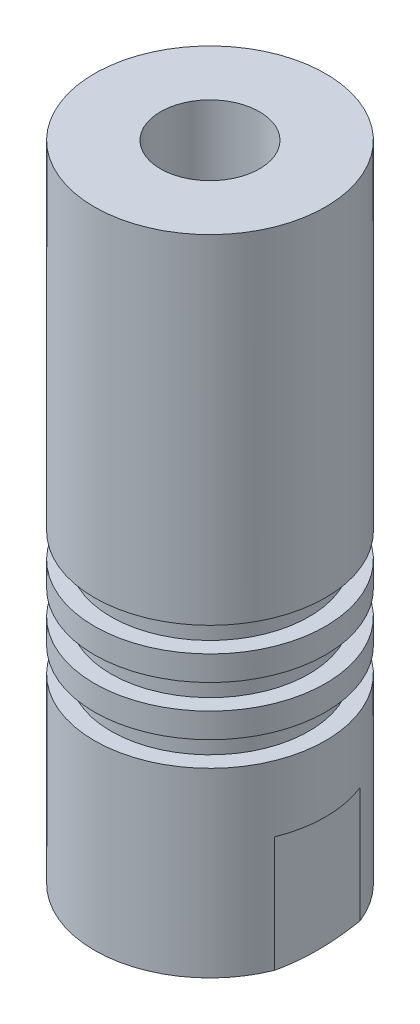
ISO-10303-21;
HEADER;
FILE_DESCRIPTION(('STEP AP214'),'2;1');
FILE_NAME('part.step','',(''),(''),'','','');
FILE_SCHEMA(('AUTOMOTIVE_DESIGN { 1 0 10303 214 1 1 1 1 }'));
ENDSEC;
DATA;
#1=APPLICATION_CONTEXT('core data for automotive mechanical design processes');
#2=APPLICATION_PROTOCOL_DEFINITION('international standard','automotive_design',2000,#1);
#3=PRODUCT_CONTEXT('',#1,'mechanical');
#4=PRODUCT('Part','Part','',(#3));
#5=PRODUCT_RELATED_PRODUCT_CATEGORY('part','',(#4));
#6=PRODUCT_DEFINITION_FORMATION('','',#4);
#7=PRODUCT_DEFINITION_CONTEXT('part definition',#1,'design');
#8=PRODUCT_DEFINITION('design','',#6,#7);
#9=PRODUCT_DEFINITION_SHAPE('','',#8);
#10=(LENGTH_UNIT() NAMED_UNIT(*) SI_UNIT(.MILLI.,.METRE.));
#11=(NAMED_UNIT(*) PLANE_ANGLE_UNIT() SI_UNIT($,.RADIAN.));
#12=(NAMED_UNIT(*) SI_UNIT($,.STERADIAN.) SOLID_ANGLE_UNIT());
#13=UNCERTAINTY_MEASURE_WITH_UNIT(LENGTH_MEASURE(1.E-05),#10,'distance_accuracy_value','');
#14=(GEOMETRIC_REPRESENTATION_CONTEXT(3) GLOBAL_UNCERTAINTY_ASSIGNED_CONTEXT((#13)) GLOBAL_UNIT_ASSIGNED_CONTEXT((#10,
#11,#12)) REPRESENTATION_CONTEXT('',''));
#15=CARTESIAN_POINT('',(0.,0.,0.));
#16=DIRECTION('',(0.,0.,1.));
#17=DIRECTION('',(1.,0.,0.));
#18=AXIS2_PLACEMENT_3D('',#15,#16,#17);
#19=CARTESIAN_POINT('',(0.,1.5,0.));
#20=DIRECTION('',(0.,1.,0.));
#21=DIRECTION('',(0.,0.,1.));
#22=AXIS2_PLACEMENT_3D('',#19,#20,#21);
#23=CONICAL_SURFACE('',#22,7.99999999999999,1.10714871779409);
#24=CARTESIAN_POINT('',(0.,0.,0.));
#25=DIRECTION('',(0.,1.,0.));
#26=DIRECTION('',(0.,0.,1.));
#27=AXIS2_PLACEMENT_3D('',#24,#25,#26);
#28=CIRCLE('',#27,4.99999999999998);
#29=CARTESIAN_POINT('',(0.,0.,4.99999999999998));
#30=VERTEX_POINT('',#29);
#31=EDGE_CURVE('E81',#30,#30,#28,.T.);
#32=ORIENTED_EDGE('',*,*,#31,.T.);
#33=EDGE_LOOP('',(#32));
#34=FACE_BOUND('',#33,.T.);
#35=CARTESIAN_POINT('',(-6.49999999999999,4.63960517836139,-12.7140020611741));
#36=CARTESIAN_POINT('',(-6.49999999999999,4.49493273691476,-12.3889791438294));
#37=CARTESIAN_POINT('',(-6.49999999999999,4.35117750702607,-12.0635434352985));
#38=CARTESIAN_POINT('',(-6.49999999999999,4.06600795170587,-11.4116234990025));
#39=CARTESIAN_POINT('',(-6.49999999999999,3.92459377917146,-11.0851392044028));
#40=CARTESIAN_POINT('',(-6.49999999999999,3.64433543055072,-10.4302489102803));
#41=CARTESIAN_POINT('',(-6.49999999999999,3.50549732908588,-10.1018403056813));
#42=CARTESIAN_POINT('',(-6.49999999999999,3.23142571950738,-9.44352872623451));
#43=CARTESIAN_POINT('',(-6.49999999999999,3.09619212071106,-9.11362578922608));
#44=CARTESIAN_POINT('',(-6.49999999999999,2.83048289305681,-8.45250376338199));
#45=CARTESIAN_POINT('',(-6.49999999999999,2.70000014874712,-8.12128754257229));
#46=CARTESIAN_POINT('',(-6.49999999999999,2.44483186701764,-7.45659634827721));
#47=CARTESIAN_POINT('',(-6.49999999999999,2.32014667007343,-7.12312124344746));
#48=CARTESIAN_POINT('',(-6.49999999999999,2.07840099908305,-6.45372644486896));
#49=CARTESIAN_POINT('',(-6.49999999999999,1.96133416663675,-6.11780905674865));
#50=CARTESIAN_POINT('',(-6.49999999999999,1.73702665581905,-5.44272397498847));
#51=CARTESIAN_POINT('',(-6.49999999999999,1.62978438251793,-5.10355681882979));
#52=CARTESIAN_POINT('',(-6.49999999999999,1.50145760944831,-4.66929022803816));
#53=CARTESIAN_POINT('',(-6.49999999999999,1.47439812441263,-4.57594563698323));
#54=CARTESIAN_POINT('',(-6.49999999999999,1.42132141191772,-4.38896083134469));
#55=CARTESIAN_POINT('',(-6.49999999999999,1.39530416853117,-4.29532062130229));
#56=CARTESIAN_POINT('',(-6.49999999999999,1.31884649816979,-4.01363447591895));
#57=CARTESIAN_POINT('',(-6.49999999999999,1.27009239909997,-3.82513345071698));
#58=CARTESIAN_POINT('',(-6.49999999999999,1.13144347216063,-3.25712110004858));
#59=CARTESIAN_POINT('',(-6.49999999999999,1.04932049996449,-2.87562365996438));
#60=CARTESIAN_POINT('',(-6.49999999999999,0.946261094020701,-2.29977813127616));
#61=CARTESIAN_POINT('',(-6.49999999999999,0.915259699355964,-2.10720712065049));
#62=CARTESIAN_POINT('',(-6.49999999999999,0.860714592579146,-1.7210183720728));
#63=CARTESIAN_POINT('',(-6.49999999999999,0.837170046736164,-1.52740075360301));
#64=CARTESIAN_POINT('',(-6.49999999999999,0.798232474629815,-1.13985753736791));
#65=CARTESIAN_POINT('',(-6.49999999999999,0.78281812154265,-0.945934097286736));
#66=CARTESIAN_POINT('',(-6.49999999999999,0.760510527948946,-0.557594838663115));
#67=CARTESIAN_POINT('',(-6.49999999999999,0.753617189046767,-0.363179025832271));
#68=CARTESIAN_POINT('',(-6.49999999999999,0.748572275423311,0.0257307608028582));
#69=CARTESIAN_POINT('',(-6.49999999999999,0.750419038007415,0.220224712703199));
#70=CARTESIAN_POINT('',(-6.49999999999999,0.76278940638265,0.608953775199544));
#71=CARTESIAN_POINT('',(-6.49999999999999,0.773314033718197,0.803188852624818));
#72=CARTESIAN_POINT('',(-6.49999999999999,0.806501889662758,1.24090602694894));
#73=CARTESIAN_POINT('',(-6.49999999999999,0.831590920516132,1.48420561931385));
#74=CARTESIAN_POINT('',(-6.49999999999999,0.893852125406738,1.96924724220696));
#75=CARTESIAN_POINT('',(-6.49999999999999,0.931025317420885,2.21098913976373));
#76=CARTESIAN_POINT('',(-6.49999999999999,1.01604103903786,2.69277716302994));
#77=CARTESIAN_POINT('',(-6.49999999999999,1.06389244038228,2.93282170644527));
#78=CARTESIAN_POINT('',(-6.49999999999999,1.16871694054054,3.41088019593747));
#79=CARTESIAN_POINT('',(-6.49999999999999,1.22568964445531,3.64889422945387));
#80=CARTESIAN_POINT('',(-6.49999999999999,1.34820588611418,4.1264246278799));
#81=CARTESIAN_POINT('',(-6.49999999999999,1.41386316573231,4.36591159529887));
#82=CARTESIAN_POINT('',(-6.49999999999999,1.55170831935892,4.84285142414976));
#83=CARTESIAN_POINT('',(-6.49999999999999,1.62389277522808,5.08030527977033));
#84=CARTESIAN_POINT('',(-6.49999999999999,1.77367698683179,5.55344813381403));
#85=CARTESIAN_POINT('',(-6.49999999999999,1.85127585874315,5.78913741335531));
#86=CARTESIAN_POINT('',(-6.49999999999999,2.01097599435672,6.2590172847031));
#87=CARTESIAN_POINT('',(-6.49999999999999,2.09307790629008,6.49320765528824));
#88=CARTESIAN_POINT('',(-6.49999999999999,2.28703034641471,7.03262988490792));
#89=CARTESIAN_POINT('',(-6.49999999999999,2.40021373679549,7.33738166221177));
#90=CARTESIAN_POINT('',(-6.49999999999999,2.63161506867892,7.94497276131788));
#91=CARTESIAN_POINT('',(-6.49999999999999,2.74983321640616,8.24781200419785));
#92=CARTESIAN_POINT('',(-6.49999999999999,2.99028703034095,8.8519169939098));
#93=CARTESIAN_POINT('',(-6.49999999999999,3.11252303289466,9.15318260654962));
#94=CARTESIAN_POINT('',(-6.49999999999999,3.36022795848007,9.75438363657073));
#95=CARTESIAN_POINT('',(-6.49999999999999,3.4856969285348,10.0543190345298));
#96=CARTESIAN_POINT('',(-6.49999999999999,3.8662108131295,10.9529295272112));
#97=CARTESIAN_POINT('',(-6.49999999999999,4.12517530296346,11.5499439611486));
#98=CARTESIAN_POINT('',(-6.49999999999999,4.65016432189855,12.7407935160942));
#99=CARTESIAN_POINT('',(-6.49999999999999,4.91618837224115,13.334628849434));
#100=CARTESIAN_POINT('',(-6.49999999999999,5.43683739745572,14.4837436524848));
#101=CARTESIAN_POINT('',(-6.49999999999999,5.69116368566189,15.0391586745477));
#102=CARTESIAN_POINT('',(-6.49999999999999,6.20312748367828,16.148471829484));
#103=CARTESIAN_POINT('',(-6.49999999999999,6.46076506083453,16.7023699312269));
#104=CARTESIAN_POINT('',(-6.49999999999999,6.97809934492668,17.8080180985776));
#105=CARTESIAN_POINT('',(-6.49999999999999,7.23779164660991,18.3597702278274));
#106=CARTESIAN_POINT('',(-6.49999999999999,7.75914833515714,19.4623190137403));
#107=CARTESIAN_POINT('',(-6.49999999999999,8.02081265352454,20.0131157027799));
#108=CARTESIAN_POINT('',(-6.49999999999999,8.28320577924075,20.5635626171586));
#109=B_SPLINE_CURVE_WITH_KNOTS('',3,(#35,#36,#37,#38,#39,#40,#41,#42,#43,#44,#45,#46,#47,#48,
#49,#50,#51,#52,#53,#54,#55,#56,#57,#58,#59,#60,#61,#62,#63,#64,#65,#66,#67,#68,#69,#70,#71,#72,
#73,#74,#75,#76,#77,#78,#79,#80,#81,#82,#83,#84,#85,#86,#87,#88,#89,#90,#91,#92,#93,#94,#95,#96,
#97,#98,#99,#100,#101,#102,#103,#104,#105,#106,#107,#108),.UNSPECIFIED.,.F.,.F.,(4,2,2,2,2,2,2,
2,2,2,2,2,2,2,2,2,2,2,2,2,2,2,2,2,2,2,2,2,2,2,2,2,2,2,2,2,4),(0.,1.06730515758636,
2.13467974924004,3.20431402837474,4.27392137202762,5.34185467005331,6.40985060614333,
7.47694343200912,8.54386271672926,8.83542135077924,9.12697552758702,9.71105511301348,
10.8808525348457,11.4658873460732,12.0508567229673,12.6342839007031,13.2177043413035,
13.8010137979488,14.3843919306593,15.1178129637762,15.8512957967343,16.5853903108169,
17.31945305149,18.0643130987016,18.8087853133975,19.5531362870632,20.2975946957999,
21.2728075860352,22.2480604596634,23.2233951834841,24.1987441014193,26.1509456097113,
28.1030150621006,29.9356240477088,31.7682703646555,33.5977016553135,35.4270696921721),.UNSPECIFIED.);
#110=CARTESIAN_POINT('',(-6.49999999999999,1.00000000000001,-2.59807621135335));
#111=VERTEX_POINT('',#110);
#112=CARTESIAN_POINT('',(-6.49999999999999,1.00000000000001,2.59807621135335));
#113=VERTEX_POINT('',#112);
#114=EDGE_CURVE('E89',#111,#113,#109,.T.);
#115=ORIENTED_EDGE('',*,*,#114,.F.);
#116=CARTESIAN_POINT('',(0.,1.00000000000001,0.));
#117=DIRECTION('',(0.,1.,0.));
#118=DIRECTION('',(0.,0.,1.));
#119=AXIS2_PLACEMENT_3D('',#116,#117,#118);
#120=CIRCLE('',#119,7.);
#121=CARTESIAN_POINT('',(6.49999999999999,1.00000000000001,-2.59807621135334));
#122=VERTEX_POINT('',#121);
#123=EDGE_CURVE('E190',#111,#122,#120,.F.);
#124=ORIENTED_EDGE('',*,*,#123,.T.);
#125=CARTESIAN_POINT('',(6.49999999999999,4.63960517836139,-12.7140020611741));
#126=CARTESIAN_POINT('',(6.49999999999999,4.49493273691476,-12.3889791438294));
#127=CARTESIAN_POINT('',(6.49999999999999,4.35117750702607,-12.0635434352985));
#128=CARTESIAN_POINT('',(6.49999999999999,4.06600795170587,-11.4116234990025));
#129=CARTESIAN_POINT('',(6.49999999999999,3.92459377917146,-11.0851392044028));
#130=CARTESIAN_POINT('',(6.49999999999999,3.64433543055072,-10.4302489102803));
#131=CARTESIAN_POINT('',(6.49999999999999,3.50549732908588,-10.1018403056813));
#132=CARTESIAN_POINT('',(6.49999999999999,3.23142571950738,-9.44352872623451));
#133=CARTESIAN_POINT('',(6.49999999999999,3.09619212071106,-9.11362578922608));
#134=CARTESIAN_POINT('',(6.49999999999999,2.83048289305681,-8.45250376338199));
#135=CARTESIAN_POINT('',(6.49999999999999,2.70000014874712,-8.12128754257229));
#136=CARTESIAN_POINT('',(6.49999999999999,2.44483186701764,-7.45659634827721));
#137=CARTESIAN_POINT('',(6.49999999999999,2.32014667007343,-7.12312124344746));
#138=CARTESIAN_POINT('',(6.49999999999999,2.07840099908305,-6.45372644486896));
#139=CARTESIAN_POINT('',(6.49999999999999,1.96133416663675,-6.11780905674865));
#140=CARTESIAN_POINT('',(6.49999999999999,1.73702665581905,-5.44272397498847));
#141=CARTESIAN_POINT('',(6.49999999999999,1.62978438251793,-5.10355681882979));
#142=CARTESIAN_POINT('',(6.49999999999999,1.50145760944831,-4.66929022803816));
#143=CARTESIAN_POINT('',(6.49999999999999,1.47439812441263,-4.57594563698323));
#144=CARTESIAN_POINT('',(6.49999999999999,1.42132141191772,-4.38896083134469));
#145=CARTESIAN_POINT('',(6.49999999999999,1.39530416853117,-4.29532062130229));
#146=CARTESIAN_POINT('',(6.49999999999999,1.31884649816979,-4.01363447591895));
#147=CARTESIAN_POINT('',(6.49999999999999,1.27009239909997,-3.82513345071698));
#148=CARTESIAN_POINT('',(6.49999999999999,1.13144347216063,-3.25712110004858));
#149=CARTESIAN_POINT('',(6.49999999999999,1.04932049996449,-2.87562365996438));
#150=CARTESIAN_POINT('',(6.49999999999999,0.946261094020701,-2.29977813127616));
#151=CARTESIAN_POINT('',(6.49999999999999,0.915259699355964,-2.10720712065049));
#152=CARTESIAN_POINT('',(6.49999999999999,0.860714592579146,-1.7210183720728));
#153=CARTESIAN_POINT('',(6.49999999999999,0.837170046736164,-1.52740075360301));
#154=CARTESIAN_POINT('',(6.49999999999999,0.798232474629815,-1.13985753736791));
#155=CARTESIAN_POINT('',(6.49999999999999,0.78281812154265,-0.945934097286736));
#156=CARTESIAN_POINT('',(6.49999999999999,0.760510527948946,-0.557594838663115));
#157=CARTESIAN_POINT('',(6.49999999999999,0.753617189046767,-0.363179025832271));
#158=CARTESIAN_POINT('',(6.49999999999999,0.748572275423311,0.0257307608028582));
#159=CARTESIAN_POINT('',(6.49999999999999,0.750419038007415,0.220224712703199));
#160=CARTESIAN_POINT('',(6.49999999999999,0.76278940638265,0.608953775199544));
#161=CARTESIAN_POINT('',(6.49999999999999,0.773314033718197,0.803188852624818));
#162=CARTESIAN_POINT('',(6.49999999999999,0.806501889662758,1.24090602694894));
#163=CARTESIAN_POINT('',(6.49999999999999,0.831590920516132,1.48420561931385));
#164=CARTESIAN_POINT('',(6.49999999999999,0.893852125406738,1.96924724220696));
#165=CARTESIAN_POINT('',(6.49999999999999,0.931025317420885,2.21098913976373));
#166=CARTESIAN_POINT('',(6.49999999999999,1.01604103903786,2.69277716302994));
#167=CARTESIAN_POINT('',(6.49999999999999,1.06389244038228,2.93282170644527));
#168=CARTESIAN_POINT('',(6.49999999999999,1.16871694054054,3.41088019593747));
#169=CARTESIAN_POINT('',(6.49999999999999,1.22568964445531,3.64889422945387));
#170=CARTESIAN_POINT('',(6.49999999999999,1.34820588611418,4.1264246278799));
#171=CARTESIAN_POINT('',(6.49999999999999,1.41386316573231,4.36591159529887));
#172=CARTESIAN_POINT('',(6.49999999999999,1.55170831935892,4.84285142414976));
#173=CARTESIAN_POINT('',(6.49999999999999,1.62389277522808,5.08030527977033));
#174=CARTESIAN_POINT('',(6.49999999999999,1.77367698683179,5.55344813381403));
#175=CARTESIAN_POINT('',(6.49999999999999,1.85127585874315,5.78913741335531));
#176=CARTESIAN_POINT('',(6.49999999999999,2.01097599435672,6.2590172847031));
#177=CARTESIAN_POINT('',(6.49999999999999,2.09307790629008,6.49320765528824));
#178=CARTESIAN_POINT('',(6.49999999999999,2.28703034641471,7.03262988490792));
#179=CARTESIAN_POINT('',(6.49999999999999,2.40021373679549,7.33738166221177));
#180=CARTESIAN_POINT('',(6.49999999999999,2.63161506867892,7.94497276131788));
#181=CARTESIAN_POINT('',(6.49999999999999,2.74983321640616,8.24781200419785));
#182=CARTESIAN_POINT('',(6.49999999999999,2.99028703034095,8.8519169939098));
#183=CARTESIAN_POINT('',(6.49999999999999,3.11252303289466,9.15318260654962));
#184=CARTESIAN_POINT('',(6.49999999999999,3.36022795848007,9.75438363657073));
#185=CARTESIAN_POINT('',(6.49999999999999,3.4856969285348,10.0543190345298));
#186=CARTESIAN_POINT('',(6.49999999999999,3.8662108131295,10.9529295272112));
#187=CARTESIAN_POINT('',(6.49999999999999,4.12517530296346,11.5499439611486));
#188=CARTESIAN_POINT('',(6.49999999999999,4.65016432189855,12.7407935160942));
#189=CARTESIAN_POINT('',(6.49999999999999,4.91618837224115,13.334628849434));
#190=CARTESIAN_POINT('',(6.49999999999999,5.43683739745572,14.4837436524848));
#191=CARTESIAN_POINT('',(6.49999999999999,5.69116368566189,15.0391586745477));
#192=CARTESIAN_POINT('',(6.49999999999999,6.20312748367828,16.148471829484));
#193=CARTESIAN_POINT('',(6.49999999999999,6.46076506083453,16.7023699312269));
#194=CARTESIAN_POINT('',(6.49999999999999,6.97809934492668,17.8080180985776));
#195=CARTESIAN_POINT('',(6.49999999999999,7.23779164660991,18.3597702278274));
#196=CARTESIAN_POINT('',(6.49999999999999,7.75914833515714,19.4623190137403));
#197=CARTESIAN_POINT('',(6.49999999999999,8.02081265352454,20.0131157027799));
#198=CARTESIAN_POINT('',(6.49999999999999,8.28320577924075,20.5635626171586));
#199=B_SPLINE_CURVE_WITH_KNOTS('',3,(#125,#126,#127,#128,#129,#130,#131,#132,#133,#134,#135,
#136,#137,#138,#139,#140,#141,#142,#143,#144,#145,#146,#147,#148,#149,#150,#151,#152,#153,#154,
#155,#156,#157,#158,#159,#160,#161,#162,#163,#164,#165,#166,#167,#168,#169,#170,#171,#172,#173,
#174,#175,#176,#177,#178,#179,#180,#181,#182,#183,#184,#185,#186,#187,#188,#189,#190,#191,#192,
#193,#194,#195,#196,#197,#198),.UNSPECIFIED.,.F.,.F.,(4,2,2,2,2,2,2,2,2,2,2,2,2,2,2,2,2,2,2,2,2,
2,2,2,2,2,2,2,2,2,2,2,2,2,2,2,4),(0.,1.06730515758636,2.13467974924004,3.20431402837474,
4.27392137202762,5.34185467005331,6.40985060614333,7.47694343200912,8.54386271672926,
8.83542135077924,9.12697552758702,9.71105511301348,10.8808525348457,11.4658873460732,
12.0508567229673,12.6342839007031,13.2177043413035,13.8010137979488,14.3843919306593,
15.1178129637762,15.8512957967343,16.5853903108169,17.31945305149,18.0643130987016,
18.8087853133975,19.5531362870632,20.2975946957999,21.2728075860352,22.2480604596634,
23.2233951834841,24.1987441014193,26.1509456097113,28.1030150621006,29.9356240477088,
31.7682703646555,33.5977016553135,35.4270696921721),.UNSPECIFIED.);
#200=CARTESIAN_POINT('',(6.49999999999999,1.00000000000001,2.59807621135334));
#201=VERTEX_POINT('',#200);
#202=EDGE_CURVE('E90',#201,#122,#199,.F.);
#203=ORIENTED_EDGE('',*,*,#202,.F.);
#204=EDGE_CURVE('E52',#201,#113,#120,.F.);
#205=ORIENTED_EDGE('',*,*,#204,.T.);
#206=EDGE_LOOP('',(#115,#124,#203,#205));
#207=FACE_BOUND('',#206,.T.);
#208=ADVANCED_FACE('F37',(#34,#207),#23,.T.);
#209=CARTESIAN_POINT('',(-6.49999999999999,7.99999999999999,8.001));
#210=DIRECTION('',(-1.,0.,0.));
#211=DIRECTION('',(0.,-1.,0.));
#212=AXIS2_PLACEMENT_3D('',#209,#210,#211);
#213=PLANE('',#212);
#214=ORIENTED_EDGE('',*,*,#114,.T.);
#215=DIRECTION('',(0.,1.,0.));
#216=VECTOR('',#215,1.);
#217=CARTESIAN_POINT('',(-6.49999999999999,-22.6274169979695,2.59807621135334));
#218=LINE('',#217,#216);
#219=CARTESIAN_POINT('',(-6.49999999999999,7.99999999999999,2.59807621135334));
#220=VERTEX_POINT('',#219);
#221=EDGE_CURVE('E189',#113,#220,#218,.T.);
#222=ORIENTED_EDGE('',*,*,#221,.T.);
#223=DIRECTION('',(0.,0.,-1.));
#224=VECTOR('',#223,1.);
#225=CARTESIAN_POINT('',(-6.49999999999999,7.99999999999999,8.001));
#226=LINE('',#225,#224);
#227=CARTESIAN_POINT('',(-6.49999999999999,7.99999999999999,-2.59807621135335));
#228=VERTEX_POINT('',#227);
#229=EDGE_CURVE('E93',#220,#228,#226,.T.);
#230=ORIENTED_EDGE('',*,*,#229,.T.);
#231=DIRECTION('',(0.,1.,0.));
#232=VECTOR('',#231,1.);
#233=CARTESIAN_POINT('',(-6.49999999999999,-22.6274169979695,-2.59807621135334));
#234=LINE('',#233,#232);
#235=EDGE_CURVE('E59',#228,#111,#234,.F.);
#236=ORIENTED_EDGE('',*,*,#235,.T.);
#237=EDGE_LOOP('',(#214,#222,#230,#236));
#238=FACE_BOUND('',#237,.T.);
#239=ADVANCED_FACE('F110',(#238),#213,.T.);
#240=CARTESIAN_POINT('',(-7.99999999999999,7.99999999999999,8.001));
#241=DIRECTION('',(0.,-1.,0.));
#242=DIRECTION('',(1.,0.,0.));
#243=AXIS2_PLACEMENT_3D('',#240,#241,#242);
#244=PLANE('',#243);
#245=ORIENTED_EDGE('',*,*,#229,.F.);
#246=CARTESIAN_POINT('',(0.,7.99999999999998,0.));
#247=DIRECTION('',(0.,-1.,0.));
#248=DIRECTION('',(1.,0.,0.));
#249=AXIS2_PLACEMENT_3D('',#246,#247,#248);
#250=CIRCLE('',#249,7.);
#251=EDGE_CURVE('E193',#220,#228,#250,.T.);
#252=ORIENTED_EDGE('',*,*,#251,.T.);
#253=EDGE_LOOP('',(#245,#252));
#254=FACE_BOUND('',#253,.T.);
#255=ADVANCED_FACE('F116',(#254),#244,.T.);
#256=CARTESIAN_POINT('',(7.99999999999999,7.99999999999999,8.001));
#257=DIRECTION('',(0.,-1.,0.));
#258=DIRECTION('',(0.,0.,-1.));
#259=AXIS2_PLACEMENT_3D('',#256,#257,#258);
#260=PLANE('',#259);
#261=DIRECTION('',(0.,0.,-1.));
#262=VECTOR('',#261,1.);
#263=CARTESIAN_POINT('',(6.49999999999999,7.99999999999999,8.001));
#264=LINE('',#263,#262);
#265=CARTESIAN_POINT('',(6.49999999999999,7.99999999999999,2.59807621135334));
#266=VERTEX_POINT('',#265);
#267=CARTESIAN_POINT('',(6.49999999999999,7.99999999999999,-2.59807621135335));
#268=VERTEX_POINT('',#267);
#269=EDGE_CURVE('E85',#266,#268,#264,.T.);
#270=ORIENTED_EDGE('',*,*,#269,.T.);
#271=CARTESIAN_POINT('',(0.,7.99999999999999,0.));
#272=DIRECTION('',(0.,-1.,0.));
#273=DIRECTION('',(0.,0.,-1.));
#274=AXIS2_PLACEMENT_3D('',#271,#272,#273);
#275=CIRCLE('',#274,7.);
#276=EDGE_CURVE('E76',#268,#266,#275,.T.);
#277=ORIENTED_EDGE('',*,*,#276,.T.);
#278=EDGE_LOOP('',(#270,#277));
#279=FACE_BOUND('',#278,.T.);
#280=ADVANCED_FACE('F84',(#279),#260,.T.);
#281=CARTESIAN_POINT('',(6.49999999999999,7.99999999999999,8.001));
#282=DIRECTION('',(1.,0.,0.));
#283=DIRECTION('',(0.,1.,0.));
#284=AXIS2_PLACEMENT_3D('',#281,#282,#283);
#285=PLANE('',#284);
#286=ORIENTED_EDGE('',*,*,#202,.T.);
#287=DIRECTION('',(0.,1.,0.));
#288=VECTOR('',#287,1.);
#289=CARTESIAN_POINT('',(6.49999999999999,-22.6274169979695,-2.59807621135334));
#290=LINE('',#289,#288);
#291=EDGE_CURVE('E11',#122,#268,#290,.T.);
#292=ORIENTED_EDGE('',*,*,#291,.T.);
#293=ORIENTED_EDGE('',*,*,#269,.F.);
#294=DIRECTION('',(0.,1.,0.));
#295=VECTOR('',#294,1.);
#296=CARTESIAN_POINT('',(6.49999999999999,-22.6274169979695,2.59807621135334));
#297=LINE('',#296,#295);
#298=EDGE_CURVE('E45',#266,#201,#297,.F.);
#299=ORIENTED_EDGE('',*,*,#298,.T.);
#300=EDGE_LOOP('',(#286,#292,#293,#299));
#301=FACE_BOUND('',#300,.T.);
#302=ADVANCED_FACE('F88',(#301),#285,.T.);
#303=CARTESIAN_POINT('',(0.,0.,0.));
#304=DIRECTION('',(0.,-1.,0.));
#305=DIRECTION('',(0.,0.,-1.));
#306=AXIS2_PLACEMENT_3D('',#303,#304,#305);
#307=PLANE('',#306);
#308=CARTESIAN_POINT('',(0.,0.,0.));
#309=DIRECTION('',(0.,-1.,0.));
#310=DIRECTION('',(0.,0.,-1.));
#311=AXIS2_PLACEMENT_3D('',#308,#309,#310);
#312=CIRCLE('',#311,3.39999999999999);
#313=CARTESIAN_POINT('',(0.,0.,-3.39999999999999));
#314=VERTEX_POINT('',#313);
#315=EDGE_CURVE('E214',#314,#314,#312,.T.);
#316=ORIENTED_EDGE('',*,*,#315,.F.);
#317=EDGE_LOOP('',(#316));
#318=FACE_BOUND('',#317,.T.);
#319=ORIENTED_EDGE('',*,*,#31,.F.);
#320=EDGE_LOOP('',(#319));
#321=FACE_BOUND('',#320,.T.);
#322=ADVANCED_FACE('F39',(#318,#321),#307,.T.);
#323=CARTESIAN_POINT('',(0.,12.,0.));
#324=DIRECTION('',(0.,-1.,0.));
#325=DIRECTION('',(0.,0.,-1.));
#326=AXIS2_PLACEMENT_3D('',#323,#324,#325);
#327=CONICAL_SURFACE('',#326,3.4,1.02974425867665);
#328=CARTESIAN_POINT('',(0.,12.,0.));
#329=DIRECTION('',(0.,-1.,0.));
#330=DIRECTION('',(0.,0.,-1.));
#331=AXIS2_PLACEMENT_3D('',#328,#329,#330);
#332=CIRCLE('',#331,3.4);
#333=CARTESIAN_POINT('',(0.,12.,-3.4));
#334=VERTEX_POINT('',#333);
#335=EDGE_CURVE('E217',#334,#334,#332,.T.);
#336=ORIENTED_EDGE('',*,*,#335,.T.);
#337=EDGE_LOOP('',(#336));
#338=FACE_BOUND('',#337,.T.);
#339=CARTESIAN_POINT('',(0.,12.240344247611,0.));
#340=DIRECTION('',(0.,-1.,0.));
#341=DIRECTION('',(0.,0.,-1.));
#342=AXIS2_PLACEMENT_3D('',#339,#340,#341);
#343=CIRCLE('',#342,3.);
#344=CARTESIAN_POINT('',(0.,12.240344247611,-3.));
#345=VERTEX_POINT('',#344);
#346=EDGE_CURVE('E219',#345,#345,#343,.T.);
#347=ORIENTED_EDGE('',*,*,#346,.F.);
#348=EDGE_LOOP('',(#347));
#349=FACE_BOUND('',#348,.T.);
#350=ADVANCED_FACE('F369',(#338,#349),#327,.F.);
#351=CARTESIAN_POINT('',(0.,0.,0.));
#352=DIRECTION('',(0.,-1.,0.));
#353=DIRECTION('',(0.,0.,-1.));
#354=AXIS2_PLACEMENT_3D('',#351,#352,#353);
#355=CYLINDRICAL_SURFACE('',#354,3.39999999999999);
#356=ORIENTED_EDGE('',*,*,#335,.F.);
#357=EDGE_LOOP('',(#356));
#358=FACE_BOUND('',#357,.T.);
#359=ORIENTED_EDGE('',*,*,#315,.T.);
#360=EDGE_LOOP('',(#359));
#361=FACE_BOUND('',#360,.T.);
#362=ADVANCED_FACE('F256',(#358,#361),#355,.F.);
#363=CARTESIAN_POINT('',(0.,-22.6274169979695,0.));
#364=DIRECTION('',(0.,1.,0.));
#365=DIRECTION('',(0.,0.,1.));
#366=AXIS2_PLACEMENT_3D('',#363,#364,#365);
#367=CYLINDRICAL_SURFACE('',#366,7.);
#368=CARTESIAN_POINT('',(0.,12.,0.));
#369=DIRECTION('',(0.,1.,0.));
#370=DIRECTION('',(0.,0.,1.));
#371=AXIS2_PLACEMENT_3D('',#368,#369,#370);
#372=CIRCLE('',#371,7.);
#373=CARTESIAN_POINT('',(0.,12.,7.));
#374=VERTEX_POINT('',#373);
#375=EDGE_CURVE('E211',#374,#374,#372,.T.);
#376=ORIENTED_EDGE('',*,*,#375,.F.);
#377=EDGE_LOOP('',(#376));
#378=FACE_BOUND('',#377,.T.);
#379=ORIENTED_EDGE('',*,*,#251,.F.);
#380=ORIENTED_EDGE('',*,*,#221,.F.);
#381=ORIENTED_EDGE('',*,*,#204,.F.);
#382=ORIENTED_EDGE('',*,*,#298,.F.);
#383=ORIENTED_EDGE('',*,*,#276,.F.);
#384=ORIENTED_EDGE('',*,*,#291,.F.);
#385=ORIENTED_EDGE('',*,*,#123,.F.);
#386=ORIENTED_EDGE('',*,*,#235,.F.);
#387=EDGE_LOOP('',(#379,#380,#381,#382,#383,#384,#385,#386));
#388=FACE_BOUND('',#387,.T.);
#389=ADVANCED_FACE('F75',(#378,#388),#367,.T.);
#390=CARTESIAN_POINT('',(0.,19.5,0.));
#391=DIRECTION('',(0.,-1.,0.));
#392=DIRECTION('',(0.,0.,-1.));
#393=AXIS2_PLACEMENT_3D('',#390,#391,#392);
#394=CIRCLE('',#393,7.);
#395=CARTESIAN_POINT('',(0.,19.5,-7.));
#396=VERTEX_POINT('',#395);
#397=EDGE_CURVE('E196',#396,#396,#394,.T.);
#398=ORIENTED_EDGE('',*,*,#397,.F.);
#399=EDGE_LOOP('',(#398));
#400=FACE_BOUND('',#399,.T.);
#401=CARTESIAN_POINT('',(0.,40.,0.));
#402=DIRECTION('',(0.,1.,0.));
#403=DIRECTION('',(0.,0.,1.));
#404=AXIS2_PLACEMENT_3D('',#401,#402,#403);
#405=CIRCLE('',#404,7.);
#406=CARTESIAN_POINT('',(0.,40.,7.));
#407=VERTEX_POINT('',#406);
#408=EDGE_CURVE('E86',#407,#407,#405,.T.);
#409=ORIENTED_EDGE('',*,*,#408,.F.);
#410=EDGE_LOOP('',(#409));
#411=FACE_BOUND('',#410,.T.);
#412=ADVANCED_FACE('F165',(#400,#411),#367,.T.);
#413=CARTESIAN_POINT('',(-8.,18.,0.));
#414=DIRECTION('',(0.,1.,0.));
#415=DIRECTION('',(0.,0.,1.));
#416=AXIS2_PLACEMENT_3D('',#413,#414,#415);
#417=PLANE('',#416);
#418=CARTESIAN_POINT('',(0.,18.,0.));
#419=DIRECTION('',(0.,1.,0.));
#420=DIRECTION('',(0.,0.,1.));
#421=AXIS2_PLACEMENT_3D('',#418,#419,#420);
#422=CIRCLE('',#421,6.);
#423=CARTESIAN_POINT('',(0.,18.,6.));
#424=VERTEX_POINT('',#423);
#425=EDGE_CURVE('E238',#424,#424,#422,.T.);
#426=ORIENTED_EDGE('',*,*,#425,.F.);
#427=EDGE_LOOP('',(#426));
#428=FACE_BOUND('',#427,.T.);
#429=CARTESIAN_POINT('',(0.,18.,0.));
#430=DIRECTION('',(0.,1.,0.));
#431=DIRECTION('',(0.,0.,1.));
#432=AXIS2_PLACEMENT_3D('',#429,#430,#431);
#433=CIRCLE('',#432,7.);
#434=CARTESIAN_POINT('',(0.,18.,7.));
#435=VERTEX_POINT('',#434);
#436=EDGE_CURVE('E199',#435,#435,#433,.T.);
#437=ORIENTED_EDGE('',*,*,#436,.T.);
#438=EDGE_LOOP('',(#437));
#439=FACE_BOUND('',#438,.T.);
#440=ADVANCED_FACE('F161',(#428,#439),#417,.T.);
#441=CARTESIAN_POINT('',(0.,129.407380346339,0.));
#442=DIRECTION('',(0.,1.,0.));
#443=DIRECTION('',(0.,0.,1.));
#444=AXIS2_PLACEMENT_3D('',#441,#442,#443);
#445=CYLINDRICAL_SURFACE('',#444,6.);
#446=ORIENTED_EDGE('',*,*,#425,.T.);
#447=EDGE_LOOP('',(#446));
#448=FACE_BOUND('',#447,.T.);
#449=CARTESIAN_POINT('',(0.,19.5,0.));
#450=DIRECTION('',(0.,1.,0.));
#451=DIRECTION('',(0.,0.,1.));
#452=AXIS2_PLACEMENT_3D('',#449,#450,#451);
#453=CIRCLE('',#452,6.);
#454=CARTESIAN_POINT('',(0.,19.5,6.));
#455=VERTEX_POINT('',#454);
#456=EDGE_CURVE('E240',#455,#455,#453,.T.);
#457=ORIENTED_EDGE('',*,*,#456,.F.);
#458=EDGE_LOOP('',(#457));
#459=FACE_BOUND('',#458,.T.);
#460=ADVANCED_FACE('F164',(#448,#459),#445,.T.);
#461=CARTESIAN_POINT('',(-6.,19.5,0.));
#462=DIRECTION('',(0.,-1.,0.));
#463=DIRECTION('',(0.,0.,-1.));
#464=AXIS2_PLACEMENT_3D('',#461,#462,#463);
#465=PLANE('',#464);
#466=ORIENTED_EDGE('',*,*,#456,.T.);
#467=EDGE_LOOP('',(#466));
#468=FACE_BOUND('',#467,.T.);
#469=ORIENTED_EDGE('',*,*,#397,.T.);
#470=EDGE_LOOP('',(#469));
#471=FACE_BOUND('',#470,.T.);
#472=ADVANCED_FACE('F169',(#468,#471),#465,.T.);
#473=CARTESIAN_POINT('',(0.,16.5,0.));
#474=DIRECTION('',(0.,-1.,0.));
#475=DIRECTION('',(0.,0.,-1.));
#476=AXIS2_PLACEMENT_3D('',#473,#474,#475);
#477=CIRCLE('',#476,7.);
#478=CARTESIAN_POINT('',(0.,16.5,-7.));
#479=VERTEX_POINT('',#478);
#480=EDGE_CURVE('E202',#479,#479,#477,.T.);
#481=ORIENTED_EDGE('',*,*,#480,.F.);
#482=EDGE_LOOP('',(#481));
#483=FACE_BOUND('',#482,.T.);
#484=ORIENTED_EDGE('',*,*,#436,.F.);
#485=EDGE_LOOP('',(#484));
#486=FACE_BOUND('',#485,.T.);
#487=ADVANCED_FACE('F152',(#483,#486),#367,.T.);
#488=CARTESIAN_POINT('',(-8.,15.,0.));
#489=DIRECTION('',(0.,1.,0.));
#490=DIRECTION('',(0.,0.,1.));
#491=AXIS2_PLACEMENT_3D('',#488,#489,#490);
#492=PLANE('',#491);
#493=CARTESIAN_POINT('',(0.,15.,0.));
#494=DIRECTION('',(0.,1.,0.));
#495=DIRECTION('',(0.,0.,1.));
#496=AXIS2_PLACEMENT_3D('',#493,#494,#495);
#497=CIRCLE('',#496,6.);
#498=CARTESIAN_POINT('',(0.,15.,6.));
#499=VERTEX_POINT('',#498);
#500=EDGE_CURVE('E232',#499,#499,#497,.T.);
#501=ORIENTED_EDGE('',*,*,#500,.F.);
#502=EDGE_LOOP('',(#501));
#503=FACE_BOUND('',#502,.T.);
#504=CARTESIAN_POINT('',(0.,15.,0.));
#505=DIRECTION('',(0.,1.,0.));
#506=DIRECTION('',(0.,0.,1.));
#507=AXIS2_PLACEMENT_3D('',#504,#505,#506);
#508=CIRCLE('',#507,7.);
#509=CARTESIAN_POINT('',(0.,15.,7.));
#510=VERTEX_POINT('',#509);
#511=EDGE_CURVE('E205',#510,#510,#508,.T.);
#512=ORIENTED_EDGE('',*,*,#511,.T.);
#513=EDGE_LOOP('',(#512));
#514=FACE_BOUND('',#513,.T.);
#515=ADVANCED_FACE('F148',(#503,#514),#492,.T.);
#516=CARTESIAN_POINT('',(0.,129.407380346339,0.));
#517=DIRECTION('',(0.,1.,0.));
#518=DIRECTION('',(0.,0.,1.));
#519=AXIS2_PLACEMENT_3D('',#516,#517,#518);
#520=CYLINDRICAL_SURFACE('',#519,6.);
#521=ORIENTED_EDGE('',*,*,#500,.T.);
#522=EDGE_LOOP('',(#521));
#523=FACE_BOUND('',#522,.T.);
#524=CARTESIAN_POINT('',(0.,16.5,0.));
#525=DIRECTION('',(0.,1.,0.));
#526=DIRECTION('',(0.,0.,1.));
#527=AXIS2_PLACEMENT_3D('',#524,#525,#526);
#528=CIRCLE('',#527,6.);
#529=CARTESIAN_POINT('',(0.,16.5,6.));
#530=VERTEX_POINT('',#529);
#531=EDGE_CURVE('E235',#530,#530,#528,.T.);
#532=ORIENTED_EDGE('',*,*,#531,.F.);
#533=EDGE_LOOP('',(#532));
#534=FACE_BOUND('',#533,.T.);
#535=ADVANCED_FACE('F151',(#523,#534),#520,.T.);
#536=CARTESIAN_POINT('',(-6.,16.5,0.));
#537=DIRECTION('',(0.,-1.,0.));
#538=DIRECTION('',(0.,0.,-1.));
#539=AXIS2_PLACEMENT_3D('',#536,#537,#538);
#540=PLANE('',#539);
#541=ORIENTED_EDGE('',*,*,#531,.T.);
#542=EDGE_LOOP('',(#541));
#543=FACE_BOUND('',#542,.T.);
#544=ORIENTED_EDGE('',*,*,#480,.T.);
#545=EDGE_LOOP('',(#544));
#546=FACE_BOUND('',#545,.T.);
#547=ADVANCED_FACE('F156',(#543,#546),#540,.T.);
#548=CARTESIAN_POINT('',(0.,13.5,0.));
#549=DIRECTION('',(0.,-1.,0.));
#550=DIRECTION('',(0.,0.,-1.));
#551=AXIS2_PLACEMENT_3D('',#548,#549,#550);
#552=CIRCLE('',#551,7.);
#553=CARTESIAN_POINT('',(0.,13.5,-7.));
#554=VERTEX_POINT('',#553);
#555=EDGE_CURVE('E208',#554,#554,#552,.T.);
#556=ORIENTED_EDGE('',*,*,#555,.F.);
#557=EDGE_LOOP('',(#556));
#558=FACE_BOUND('',#557,.T.);
#559=ORIENTED_EDGE('',*,*,#511,.F.);
#560=EDGE_LOOP('',(#559));
#561=FACE_BOUND('',#560,.T.);
#562=ADVANCED_FACE('F138',(#558,#561),#367,.T.);
#563=CARTESIAN_POINT('',(-7.99999999999998,12.,0.));
#564=DIRECTION('',(0.,1.,0.));
#565=DIRECTION('',(0.,0.,1.));
#566=AXIS2_PLACEMENT_3D('',#563,#564,#565);
#567=PLANE('',#566);
#568=CARTESIAN_POINT('',(0.,12.,0.));
#569=DIRECTION('',(0.,1.,0.));
#570=DIRECTION('',(0.,0.,1.));
#571=AXIS2_PLACEMENT_3D('',#568,#569,#570);
#572=CIRCLE('',#571,5.99999999999998);
#573=CARTESIAN_POINT('',(0.,12.,5.99999999999998));
#574=VERTEX_POINT('',#573);
#575=EDGE_CURVE('E226',#574,#574,#572,.T.);
#576=ORIENTED_EDGE('',*,*,#575,.F.);
#577=EDGE_LOOP('',(#576));
#578=FACE_BOUND('',#577,.T.);
#579=ORIENTED_EDGE('',*,*,#375,.T.);
#580=EDGE_LOOP('',(#579));
#581=FACE_BOUND('',#580,.T.);
#582=ADVANCED_FACE('F134',(#578,#581),#567,.T.);
#583=CARTESIAN_POINT('',(0.,129.407380346339,0.));
#584=DIRECTION('',(0.,1.,0.));
#585=DIRECTION('',(0.,0.,1.));
#586=AXIS2_PLACEMENT_3D('',#583,#584,#585);
#587=CYLINDRICAL_SURFACE('',#586,5.99999999999999);
#588=ORIENTED_EDGE('',*,*,#575,.T.);
#589=EDGE_LOOP('',(#588));
#590=FACE_BOUND('',#589,.T.);
#591=CARTESIAN_POINT('',(0.,13.5,0.));
#592=DIRECTION('',(0.,1.,0.));
#593=DIRECTION('',(0.,0.,1.));
#594=AXIS2_PLACEMENT_3D('',#591,#592,#593);
#595=CIRCLE('',#594,6.);
#596=CARTESIAN_POINT('',(0.,13.5,6.));
#597=VERTEX_POINT('',#596);
#598=EDGE_CURVE('E229',#597,#597,#595,.T.);
#599=ORIENTED_EDGE('',*,*,#598,.F.);
#600=EDGE_LOOP('',(#599));
#601=FACE_BOUND('',#600,.T.);
#602=ADVANCED_FACE('F137',(#590,#601),#587,.T.);
#603=CARTESIAN_POINT('',(-6.,13.5,0.));
#604=DIRECTION('',(0.,-1.,0.));
#605=DIRECTION('',(0.,0.,-1.));
#606=AXIS2_PLACEMENT_3D('',#603,#604,#605);
#607=PLANE('',#606);
#608=ORIENTED_EDGE('',*,*,#598,.T.);
#609=EDGE_LOOP('',(#608));
#610=FACE_BOUND('',#609,.T.);
#611=ORIENTED_EDGE('',*,*,#555,.T.);
#612=EDGE_LOOP('',(#611));
#613=FACE_BOUND('',#612,.T.);
#614=ADVANCED_FACE('F142',(#610,#613),#607,.T.);
#615=CARTESIAN_POINT('',(0.,0.,0.));
#616=DIRECTION('',(0.,1.,0.));
#617=DIRECTION('',(0.,0.,1.));
#618=AXIS2_PLACEMENT_3D('',#615,#616,#617);
#619=CYLINDRICAL_SURFACE('',#618,3.);
#620=CARTESIAN_POINT('',(0.,40.,0.));
#621=DIRECTION('',(0.,1.,0.));
#622=DIRECTION('',(0.,0.,1.));
#623=AXIS2_PLACEMENT_3D('',#620,#621,#622);
#624=CIRCLE('',#623,3.);
#625=CARTESIAN_POINT('',(0.,40.,3.));
#626=VERTEX_POINT('',#625);
#627=EDGE_CURVE('E95',#626,#626,#624,.T.);
#628=ORIENTED_EDGE('',*,*,#627,.T.);
#629=EDGE_LOOP('',(#628));
#630=FACE_BOUND('',#629,.T.);
#631=ORIENTED_EDGE('',*,*,#346,.T.);
#632=EDGE_LOOP('',(#631));
#633=FACE_BOUND('',#632,.T.);
#634=ADVANCED_FACE('F146',(#630,#633),#619,.F.);
#635=CARTESIAN_POINT('',(-7.99999999999998,40.,0.));
#636=DIRECTION('',(0.,1.,0.));
#637=DIRECTION('',(0.,0.,1.));
#638=AXIS2_PLACEMENT_3D('',#635,#636,#637);
#639=PLANE('',#638);
#640=ORIENTED_EDGE('',*,*,#627,.F.);
#641=EDGE_LOOP('',(#640));
#642=FACE_BOUND('',#641,.T.);
#643=ORIENTED_EDGE('',*,*,#408,.T.);
#644=EDGE_LOOP('',(#643));
#645=FACE_BOUND('',#644,.T.);
#646=ADVANCED_FACE('F173',(#642,#645),#639,.T.);
#647=CLOSED_SHELL('',(#208,#239,#255,#280,#302,#322,#350,#362,#389,#412,#440,#460,#472,#487,
#515,#535,#547,#562,#582,#602,#614,#634,#646));
#648=MANIFOLD_SOLID_BREP('B2',#647);
#649=ADVANCED_BREP_SHAPE_REPRESENTATION('',(#18,#648),#14);
#650=SHAPE_DEFINITION_REPRESENTATION(#9,#649);
ENDSEC;
END-ISO-10303-21;
